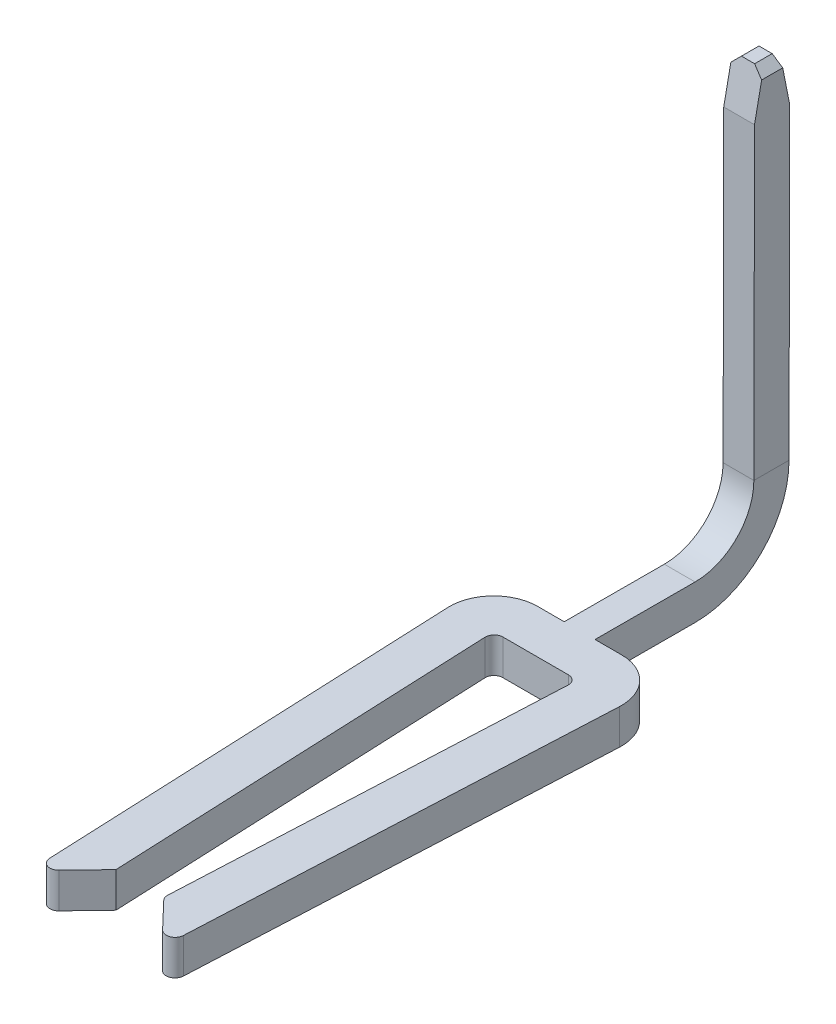
ISO-10303-21;
HEADER;
FILE_DESCRIPTION(('STEP AP214'),'2;1');
FILE_NAME('part.step','',(''),(''),'','','');
FILE_SCHEMA(('AUTOMOTIVE_DESIGN { 1 0 10303 214 1 1 1 1 }'));
ENDSEC;
DATA;
#1=APPLICATION_CONTEXT('core data for automotive mechanical design processes');
#2=APPLICATION_PROTOCOL_DEFINITION('international standard','automotive_design',2000,#1);
#3=PRODUCT_CONTEXT('',#1,'mechanical');
#4=PRODUCT('Part','Part','',(#3));
#5=PRODUCT_RELATED_PRODUCT_CATEGORY('part','',(#4));
#6=PRODUCT_DEFINITION_FORMATION('','',#4);
#7=PRODUCT_DEFINITION_CONTEXT('part definition',#1,'design');
#8=PRODUCT_DEFINITION('design','',#6,#7);
#9=PRODUCT_DEFINITION_SHAPE('','',#8);
#10=(LENGTH_UNIT() NAMED_UNIT(*) SI_UNIT(.MILLI.,.METRE.));
#11=(NAMED_UNIT(*) PLANE_ANGLE_UNIT() SI_UNIT($,.RADIAN.));
#12=(NAMED_UNIT(*) SI_UNIT($,.STERADIAN.) SOLID_ANGLE_UNIT());
#13=UNCERTAINTY_MEASURE_WITH_UNIT(LENGTH_MEASURE(1.E-05),#10,'distance_accuracy_value','');
#14=(GEOMETRIC_REPRESENTATION_CONTEXT(3) GLOBAL_UNCERTAINTY_ASSIGNED_CONTEXT((#13)) GLOBAL_UNIT_ASSIGNED_CONTEXT((#10,
#11,#12)) REPRESENTATION_CONTEXT('',''));
#15=CARTESIAN_POINT('',(0.,0.,0.));
#16=DIRECTION('',(0.,0.,1.));
#17=DIRECTION('',(1.,0.,0.));
#18=AXIS2_PLACEMENT_3D('',#15,#16,#17);
#19=CARTESIAN_POINT('',(0.175007184791,-1.635275026444,-1.901700244763));
#20=DIRECTION('',(0.999999999989373,3.26328490643722E-06,3.25642428496722E-06));
#21=DIRECTION('',(-3.26328490645452E-06,0.999999999994676,0.));
#22=AXIS2_PLACEMENT_3D('',#19,#20,#21);
#23=PLANE('',#22);
#24=DIRECTION('',(-4.07195006625834E-06,0.999997785368175,-0.00210457648106398));
#25=VECTOR('',#24,1.);
#26=CARTESIAN_POINT('',(0.175001265748,0.864719102488,-1.90696168524801));
#27=LINE('',#26,#25);
#28=CARTESIAN_POINT('',(0.175001265748064,0.864719057054746,-1.90696168515226));
#29=VERTEX_POINT('',#28);
#30=CARTESIAN_POINT('',(0.174986703487548,4.3647108574861,-1.91432775567154));
#31=VERTEX_POINT('',#30);
#32=EDGE_CURVE('E227',#29,#31,#27,.T.);
#33=ORIENTED_EDGE('',*,*,#32,.T.);
#34=DIRECTION('',(0.,0.980991245476944,0.194051993799582));
#35=VECTOR('',#34,1.);
#36=CARTESIAN_POINT('',(0.174986082613,4.86492037806116,-1.81538034350575));
#37=LINE('',#36,#35);
#38=CARTESIAN_POINT('',(0.174986082613017,4.76487916604904,-1.83516971139514));
#39=VERTEX_POINT('',#38);
#40=EDGE_CURVE('E203',#39,#31,#37,.F.);
#41=ORIENTED_EDGE('',*,*,#40,.F.);
#42=DIRECTION('',(-3.30868077392644E-06,0.00210462186325552,0.99999778527548));
#43=VECTOR('',#42,1.);
#44=CARTESIAN_POINT('',(0.17498608261305,4.76487916604905,-1.835169711395));
#45=LINE('',#44,#43);
#46=CARTESIAN_POINT('',(0.17498529579303,4.76538428612037,-1.59517027672773));
#47=VERTEX_POINT('',#46);
#48=EDGE_CURVE('E201',#39,#47,#45,.T.);
#49=ORIENTED_EDGE('',*,*,#48,.T.);
#50=DIRECTION('',(2.55320347847857E-06,-0.980165740764821,0.198179516157528));
#51=VECTOR('',#50,1.);
#52=CARTESIAN_POINT('',(0.174985299424531,4.765384286063,-1.595170303966));
#53=LINE('',#52,#51);
#54=CARTESIAN_POINT('',(0.174985762316875,4.36555335752195,-1.51432857148358));
#55=VERTEX_POINT('',#54);
#56=EDGE_CURVE('E186',#47,#55,#53,.T.);
#57=ORIENTED_EDGE('',*,*,#56,.T.);
#58=DIRECTION('',(-4.08966885710381E-06,0.999997785368103,-0.00210457648112173));
#59=VECTOR('',#58,1.);
#60=CARTESIAN_POINT('',(0.174999960434,0.865561368804003,-1.50696257201604));
#61=LINE('',#60,#59);
#62=CARTESIAN_POINT('',(0.174999960433802,0.865561261852998,-1.50696257179114));
#63=VERTEX_POINT('',#62);
#64=EDGE_CURVE('E215',#63,#55,#61,.T.);
#65=ORIENTED_EDGE('',*,*,#64,.F.);
#66=DIRECTION('',(3.26328845320044E-06,-0.00210566578999659,-0.999997783078009));
#67=VECTOR('',#66,1.);
#68=CARTESIAN_POINT('',(0.174997738415994,0.86556136879675,-1.50696257202324));
#69=LINE('',#68,#67);
#70=EDGE_CURVE('E198',#63,#29,#69,.T.);
#71=ORIENTED_EDGE('',*,*,#70,.T.);
#72=EDGE_LOOP('',(#33,#41,#49,#57,#65,#71));
#73=FACE_BOUND('',#72,.T.);
#74=ADVANCED_FACE('F17',(#73),#23,.T.);
#75=CARTESIAN_POINT('',(0.07498536537731,4.865131167434,-1.715380760441));
#76=DIRECTION('',(-0.707104478539354,-0.707107522698354,0.00148585765971574));
#77=DIRECTION('',(0.70710830326609,-0.707105259103729,0.));
#78=AXIS2_PLACEMENT_3D('',#75,#76,#77);
#79=PLANE('',#78);
#80=ORIENTED_EDGE('',*,*,#48,.F.);
#81=DIRECTION('',(0.700142727687881,-0.700430955632422,-0.13855192982281));
#82=VECTOR('',#81,1.);
#83=CARTESIAN_POINT('',(0.0749860891614756,4.8649203265247,-1.81538061479096));
#84=LINE('',#83,#82);
#85=CARTESIAN_POINT('',(0.0749858234301481,4.86492035862576,-1.81538064601225));
#86=VERTEX_POINT('',#85);
#87=EDGE_CURVE('E234',#86,#39,#84,.T.);
#88=ORIENTED_EDGE('',*,*,#87,.F.);
#89=DIRECTION('',(0.,0.00210457647842051,0.999997785376471));
#90=VECTOR('',#89,1.);
#91=CARTESIAN_POINT('',(0.0749850053663229,4.86513116691711,-1.715381005187));
#92=LINE('',#91,#90);
#93=CARTESIAN_POINT('',(0.0749851518626242,4.86534139644322,-1.61538091278752));
#94=VERTEX_POINT('',#93);
#95=EDGE_CURVE('E207',#94,#86,#92,.F.);
#96=ORIENTED_EDGE('',*,*,#95,.F.);
#97=DIRECTION('',(0.700142542464223,-0.699840855927141,0.141503344861177));
#98=VECTOR('',#97,1.);
#99=CARTESIAN_POINT('',(0.0749850053667493,4.86534150170193,-1.61538095695846));
#100=LINE('',#99,#98);
#101=EDGE_CURVE('E192',#94,#47,#100,.T.);
#102=ORIENTED_EDGE('',*,*,#101,.T.);
#103=EDGE_LOOP('',(#80,#88,#96,#102));
#104=FACE_BOUND('',#103,.T.);
#105=ADVANCED_FACE('F209',(#104),#79,.F.);
#106=CARTESIAN_POINT('',(-1.463462188596E-05,4.865130922687,-1.715381004673));
#107=DIRECTION('',(-3.25642428491755E-06,0.999997785371169,-0.00210457647840935));
#108=DIRECTION('',(0.,0.00210457647842051,0.999997785376471));
#109=AXIS2_PLACEMENT_3D('',#106,#107,#108);
#110=PLANE('',#109);
#111=DIRECTION('',(0.999999999992633,7.60721855878472E-07,3.76241672235528E-06));
#112=VECTOR('',#111,1.);
#113=CARTESIAN_POINT('',(-1.496095037655E-05,4.86534122499831,-1.61538119472873));
#114=LINE('',#113,#112);
#115=CARTESIAN_POINT('',(-0.0750149555543873,4.86534114980943,-1.61538154880574));
#116=VERTEX_POINT('',#115);
#117=EDGE_CURVE('E211',#116,#94,#114,.T.);
#118=ORIENTED_EDGE('',*,*,#117,.T.);
#119=ORIENTED_EDGE('',*,*,#95,.T.);
#120=DIRECTION('',(0.99999999999672,-4.97020864438531E-07,2.51259009138112E-06));
#121=VECTOR('',#120,1.);
#122=CARTESIAN_POINT('',(-1.430829339538E-05,4.86492022044195,-1.81538083159447));
#123=LINE('',#122,#121);
#124=CARTESIAN_POINT('',(-0.0750141915805117,4.86492031057738,-1.81538102513748));
#125=VERTEX_POINT('',#124);
#126=EDGE_CURVE('E238',#125,#86,#123,.T.);
#127=ORIENTED_EDGE('',*,*,#126,.F.);
#128=DIRECTION('',(-3.81987094945477E-06,0.00210401987934018,0.999997786540428));
#129=VECTOR('',#128,1.);
#130=CARTESIAN_POINT('',(-0.0750141915804922,4.86492033700683,-1.81538102768701));
#131=LINE('',#130,#129);
#132=EDGE_CURVE('E213',#125,#116,#131,.T.);
#133=ORIENTED_EDGE('',*,*,#132,.T.);
#134=EDGE_LOOP('',(#118,#119,#127,#133));
#135=FACE_BOUND('',#134,.T.);
#136=ADVANCED_FACE('F347',(#135),#110,.T.);
#137=CARTESIAN_POINT('',(-1.430829339538E-05,4.86492046504,-1.81538078321));
#138=DIRECTION('',(2.56127677282129E-06,0.194051993798946,-0.980991245473727));
#139=DIRECTION('',(0.,0.980991245476944,0.194051993799582));
#140=AXIS2_PLACEMENT_3D('',#137,#138,#139);
#141=PLANE('',#140);
#142=ORIENTED_EDGE('',*,*,#40,.T.);
#143=DIRECTION('',(0.999999999994675,6.8678326205611E-09,3.26327767890409E-06));
#144=VECTOR('',#143,1.);
#145=CARTESIAN_POINT('',(-0.660698484761,4.3647108411043,-1.91433042894395));
#146=LINE('',#145,#144);
#147=CARTESIAN_POINT('',(-0.175015510132432,4.36471074053463,-1.91432884380651));
#148=VERTEX_POINT('',#147);
#149=EDGE_CURVE('E160',#31,#148,#146,.F.);
#150=ORIENTED_EDGE('',*,*,#149,.T.);
#151=DIRECTION('',(4.7174800590008E-06,-0.980991172480558,-0.194052362760582));
#152=VECTOR('',#151,1.);
#153=CARTESIAN_POINT('',(-0.175017434485288,4.764876273044,-1.835171070071));
#154=LINE('',#153,#152);
#155=CARTESIAN_POINT('',(-0.175017212198714,4.7648757647061,-1.8351711400612));
#156=VERTEX_POINT('',#155);
#157=EDGE_CURVE('E352',#156,#148,#154,.T.);
#158=ORIENTED_EDGE('',*,*,#157,.F.);
#159=DIRECTION('',(0.70013752989478,0.700435695926638,0.138554231637299));
#160=VECTOR('',#159,1.);
#161=CARTESIAN_POINT('',(-0.175016551117714,4.76487538968443,-1.83517106820902));
#162=LINE('',#161,#160);
#163=EDGE_CURVE('E341',#156,#125,#162,.T.);
#164=ORIENTED_EDGE('',*,*,#163,.T.);
#165=ORIENTED_EDGE('',*,*,#126,.T.);
#166=ORIENTED_EDGE('',*,*,#87,.T.);
#167=EDGE_LOOP('',(#142,#150,#158,#164,#165,#166));
#168=FACE_BOUND('',#167,.T.);
#169=ADVANCED_FACE('F349',(#168),#141,.T.);
#170=CARTESIAN_POINT('',(-0.660698484761,-6.897092851477,-1.890629049418));
#171=DIRECTION('',(-3.26328490585155E-06,0.00210457646778235,0.999997785371169));
#172=DIRECTION('',(0.,-0.999997785376493,0.00210457646779356));
#173=AXIS2_PLACEMENT_3D('',#170,#171,#172);
#174=PLANE('',#173);
#175=DIRECTION('',(0.999999999994675,6.8678326205611E-09,3.26327767890409E-06));
#176=VECTOR('',#175,1.);
#177=CARTESIAN_POINT('',(-0.660698484761,0.864719005889311,-1.90696441217713));
#178=LINE('',#177,#176);
#179=CARTESIAN_POINT('',(-0.175000956269712,0.864719059929716,-1.90696282731777));
#180=VERTEX_POINT('',#179);
#181=EDGE_CURVE('E230',#180,#29,#178,.T.);
#182=ORIENTED_EDGE('',*,*,#181,.F.);
#183=DIRECTION('',(4.15824722816176E-06,-0.999997785367819,0.0021045764812607));
#184=VECTOR('',#183,1.);
#185=CARTESIAN_POINT('',(-0.175015510132432,4.364710688582,-1.914328843697));
#186=LINE('',#185,#184);
#187=EDGE_CURVE('E372',#148,#180,#186,.T.);
#188=ORIENTED_EDGE('',*,*,#187,.F.);
#189=ORIENTED_EDGE('',*,*,#149,.F.);
#190=ORIENTED_EDGE('',*,*,#32,.F.);
#191=EDGE_LOOP('',(#182,#188,#189,#190));
#192=FACE_BOUND('',#191,.T.);
#193=ADVANCED_FACE('F389',(#192),#174,.F.);
#194=CARTESIAN_POINT('',(-0.660699790075,-6.89625102089,-1.490629935269));
#195=DIRECTION('',(-3.26328490585155E-06,0.00210457646778235,0.999997785371169));
#196=DIRECTION('',(0.,-0.999997785376493,0.00210457646779356));
#197=AXIS2_PLACEMENT_3D('',#194,#195,#196);
#198=PLANE('',#197);
#199=DIRECTION('',(0.999999999992633,7.60721855878472E-07,3.76241672235528E-06));
#200=VECTOR('',#199,1.);
#201=CARTESIAN_POINT('',(-1.496095037655E-05,4.36555322510836,-1.51432921593992));
#202=LINE('',#201,#200);
#203=CARTESIAN_POINT('',(-0.17501681544553,4.36555277251354,-1.51432980977728));
#204=VERTEX_POINT('',#203);
#205=EDGE_CURVE('E194',#55,#204,#202,.F.);
#206=ORIENTED_EDGE('',*,*,#205,.T.);
#207=DIRECTION('',(-4.15824718365189E-06,0.999997785339116,-0.00210459011975487));
#208=VECTOR('',#207,1.);
#209=CARTESIAN_POINT('',(-0.175002261582777,0.865560938618,-1.506963713271));
#210=LINE('',#209,#208);
#211=CARTESIAN_POINT('',(-0.175002261582763,0.865560935371559,-1.50696371326376));
#212=VERTEX_POINT('',#211);
#213=EDGE_CURVE('E320',#212,#204,#210,.T.);
#214=ORIENTED_EDGE('',*,*,#213,.F.);
#215=DIRECTION('',(0.999999999994675,6.8678326205611E-09,3.26327767890409E-06));
#216=VECTOR('',#215,1.);
#217=CARTESIAN_POINT('',(-0.660699790075,0.865560935282314,-1.50696529823608));
#218=LINE('',#217,#216);
#219=EDGE_CURVE('E229',#212,#63,#218,.T.);
#220=ORIENTED_EDGE('',*,*,#219,.T.);
#221=ORIENTED_EDGE('',*,*,#64,.T.);
#222=EDGE_LOOP('',(#206,#214,#220,#221));
#223=FACE_BOUND('',#222,.T.);
#224=ADVANCED_FACE('F399',(#223),#198,.T.);
#225=CARTESIAN_POINT('',(-1.496095037655E-05,4.865341380334,-1.615381226136));
#226=DIRECTION('',(3.8385514630743E-06,-0.198179407828912,-0.980165762663565));
#227=DIRECTION('',(0.,0.980165762670786,-0.198179407830372));
#228=AXIS2_PLACEMENT_3D('',#225,#226,#227);
#229=PLANE('',#228);
#230=DIRECTION('',(-3.43751459113788E-06,0.980165762662906,-0.198179407839529));
#231=VECTOR('',#230,1.);
#232=CARTESIAN_POINT('',(-0.17501681544553,4.36555261278,-1.514329777481));
#233=LINE('',#232,#231);
#234=CARTESIAN_POINT('',(-0.175017074048855,4.76538265680208,-1.59517134719816));
#235=VERTEX_POINT('',#234);
#236=EDGE_CURVE('E314',#204,#235,#233,.T.);
#237=ORIENTED_EDGE('',*,*,#236,.F.);
#238=ORIENTED_EDGE('',*,*,#205,.F.);
#239=ORIENTED_EDGE('',*,*,#56,.F.);
#240=ORIENTED_EDGE('',*,*,#101,.F.);
#241=ORIENTED_EDGE('',*,*,#117,.F.);
#242=DIRECTION('',(-0.700138302177797,-0.69984616149523,0.141498085018792));
#243=VECTOR('',#242,1.);
#244=CARTESIAN_POINT('',(-0.0750149555542452,4.86534114074205,-1.61538158475363));
#245=LINE('',#244,#243);
#246=EDGE_CURVE('E334',#116,#235,#245,.T.);
#247=ORIENTED_EDGE('',*,*,#246,.T.);
#248=EDGE_LOOP('',(#237,#238,#239,#240,#241,#247));
#249=FACE_BOUND('',#248,.T.);
#250=ADVANCED_FACE('F189',(#249),#229,.F.);
#251=CARTESIAN_POINT('',(-0.07501463462109,4.865130677941,-1.715381248905));
#252=DIRECTION('',(0.707109083818662,-0.707102907716663,0.00149046293910129));
#253=DIRECTION('',(0.707103693125375,0.707109869234234,0.));
#254=AXIS2_PLACEMENT_3D('',#251,#252,#253);
#255=PLANE('',#254);
#256=DIRECTION('',(3.26330253224649E-06,-0.00210947513947798,-0.999997775049518));
#257=VECTOR('',#256,1.);
#258=CARTESIAN_POINT('',(-0.175018217678997,4.76538254778951,-1.59517126651795));
#259=LINE('',#258,#257);
#260=EDGE_CURVE('E308',#235,#156,#259,.T.);
#261=ORIENTED_EDGE('',*,*,#260,.F.);
#262=ORIENTED_EDGE('',*,*,#246,.F.);
#263=ORIENTED_EDGE('',*,*,#132,.F.);
#264=ORIENTED_EDGE('',*,*,#163,.F.);
#265=EDGE_LOOP('',(#261,#262,#263,#264));
#266=FACE_BOUND('',#265,.T.);
#267=ADVANCED_FACE('F355',(#266),#255,.F.);
#268=CARTESIAN_POINT('',(-0.175000956267,0.864718407818,-1.906962825945));
#269=DIRECTION('',(-0.99999999998603,-4.16510584607213E-06,-3.2545235860591E-06));
#270=DIRECTION('',(4.16510584609418E-06,-0.999999999991326,0.));
#271=AXIS2_PLACEMENT_3D('',#268,#269,#270);
#272=PLANE('',#271);
#273=ORIENTED_EDGE('',*,*,#236,.T.);
#274=ORIENTED_EDGE('',*,*,#260,.T.);
#275=ORIENTED_EDGE('',*,*,#157,.T.);
#276=ORIENTED_EDGE('',*,*,#187,.T.);
#277=CARTESIAN_POINT('',(-0.175004438076532,0.866964619264,-0.840000571091002));
#278=DIRECTION('',(-0.99999999998603,-4.16510584607213E-06,-3.2545235860591E-06));
#279=DIRECTION('',(4.16510584609418E-06,-0.999999999991326,0.));
#280=AXIS2_PLACEMENT_3D('',#277,#278,#279);
#281=CIRCLE('',#280,1.066964619264);
#282=CARTESIAN_POINT('',(-0.175000001373896,-0.199997635597067,-0.837754366385486));
#283=VERTEX_POINT('',#282);
#284=EDGE_CURVE('E306',#283,#180,#281,.F.);
#285=ORIENTED_EDGE('',*,*,#284,.F.);
#286=DIRECTION('',(-4.15825071394713E-06,0.999997787615261,-0.00210350832939722));
#287=VECTOR('',#286,1.);
#288=CARTESIAN_POINT('',(-0.175000001374678,-0.199997636534373,-0.837754812455384));
#289=LINE('',#288,#287);
#290=CARTESIAN_POINT('',(-0.175001248160876,0.200001478314055,-0.838596305500264));
#291=VERTEX_POINT('',#290);
#292=EDGE_CURVE('E364',#283,#291,#289,.T.);
#293=ORIENTED_EDGE('',*,*,#292,.T.);
#294=CARTESIAN_POINT('',(-0.175004438076532,0.866964619264,-0.840000571091002));
#295=DIRECTION('',(-0.99999999998603,-4.16510584607213E-06,-3.2545235860591E-06));
#296=DIRECTION('',(4.16510584609418E-06,-0.999999999991326,0.));
#297=AXIS2_PLACEMENT_3D('',#294,#295,#296);
#298=CIRCLE('',#297,0.666964619264);
#299=EDGE_CURVE('E20',#291,#212,#298,.F.);
#300=ORIENTED_EDGE('',*,*,#299,.T.);
#301=ORIENTED_EDGE('',*,*,#213,.T.);
#302=EDGE_LOOP('',(#273,#274,#275,#276,#285,#293,#300,#301));
#303=FACE_BOUND('',#302,.T.);
#304=ADVANCED_FACE('F358',(#303),#272,.T.);
#305=CARTESIAN_POINT('',(-0.175004437551,0.866964619264,-0.840000571091));
#306=DIRECTION('',(0.999999999994676,0.,3.26329213278694E-06));
#307=DIRECTION('',(3.26329213278694E-06,0.,-0.999999999994676));
#308=AXIS2_PLACEMENT_3D('',#305,#306,#307);
#309=CYLINDRICAL_SURFACE('',#308,1.066964619264);
#310=ORIENTED_EDGE('',*,*,#284,.T.);
#311=ORIENTED_EDGE('',*,*,#181,.T.);
#312=CARTESIAN_POINT('',(0.175000005953661,0.866964619264,-0.839999428924253));
#313=DIRECTION('',(0.999999999999593,-8.76572615124444E-09,-9.01817128790433E-07));
#314=DIRECTION('',(-9.01817128790433E-07,0.,-0.999999999999593));
#315=AXIS2_PLACEMENT_3D('',#312,#313,#314);
#316=CIRCLE('',#315,1.066964619264);
#317=CARTESIAN_POINT('',(0.174999998626113,-0.199997636811358,-0.837753795295367));
#318=VERTEX_POINT('',#317);
#319=EDGE_CURVE('E275',#318,#29,#316,.T.);
#320=ORIENTED_EDGE('',*,*,#319,.F.);
#321=DIRECTION('',(1.,-6.86783262048714E-09,1.44539109276797E-11));
#322=VECTOR('',#321,1.);
#323=CARTESIAN_POINT('',(-0.660722805629,-0.199997630809533,-0.837753670307077));
#324=LINE('',#323,#322);
#325=EDGE_CURVE('E305',#318,#283,#324,.F.);
#326=ORIENTED_EDGE('',*,*,#325,.T.);
#327=EDGE_LOOP('',(#310,#311,#320,#326));
#328=FACE_BOUND('',#327,.T.);
#329=ADVANCED_FACE('F392',(#328),#309,.T.);
#330=CARTESIAN_POINT('',(-0.660722805629,-0.186528338606,5.562233491171));
#331=DIRECTION('',(6.86784783018439E-09,0.999997785376493,-0.00210457646777704));
#332=DIRECTION('',(0.,0.00210457646777704,0.999997785376493));
#333=AXIS2_PLACEMENT_3D('',#330,#331,#332);
#334=PLANE('',#333);
#335=DIRECTION('',(0.690866245713118,-0.0015215768985155,-0.722980992376704));
#336=VECTOR('',#335,1.);
#337=CARTESIAN_POINT('',(-0.588424546285314,-0.186382941018001,5.6313199627507));
#338=LINE('',#337,#336);
#339=CARTESIAN_POINT('',(-0.588424546281254,-0.186382941017999,5.63131996274646));
#340=VERTEX_POINT('',#339);
#341=CARTESIAN_POINT('',(-0.272211011649011,-0.187079375693,5.30040732011809));
#342=VERTEX_POINT('',#341);
#343=EDGE_CURVE('E304',#340,#342,#338,.T.);
#344=ORIENTED_EDGE('',*,*,#343,.F.);
#345=CARTESIAN_POINT('',(-0.660722805629,-0.186528338605776,5.562233491171));
#346=DIRECTION('',(6.86784783018439E-09,0.999997785376493,-0.00210457646777704));
#347=DIRECTION('',(0.,0.00210457646777704,0.999997785376493));
#348=AXIS2_PLACEMENT_3D('',#345,#346,#347);
#349=CIRCLE('',#348,0.09999999999961);
#350=CARTESIAN_POINT('',(-0.760619662735631,-0.186518781673089,5.56677417930156));
#351=VERTEX_POINT('',#350);
#352=EDGE_CURVE('E303',#351,#340,#349,.T.);
#353=ORIENTED_EDGE('',*,*,#352,.F.);
#354=DIRECTION('',(0.0454076609258709,0.00210240536994618,0.998966327871416));
#355=VECTOR('',#354,1.);
#356=CARTESIAN_POINT('',(-0.976240736340313,-0.196502183015,0.823121066176969));
#357=LINE('',#356,#355);
#358=CARTESIAN_POINT('',(-0.976240736340649,-0.196502183015032,0.823121066176624));
#359=VERTEX_POINT('',#358);
#360=EDGE_CURVE('E270',#359,#351,#357,.T.);
#361=ORIENTED_EDGE('',*,*,#360,.F.);
#362=CARTESIAN_POINT('',(-0.476756466236,-0.196549968392728,0.800417286001));
#363=DIRECTION('',(6.86784783018439E-09,0.999997785376493,-0.00210457646777704));
#364=DIRECTION('',(0.,0.00210457646777704,0.999997785376493));
#365=AXIS2_PLACEMENT_3D('',#362,#363,#364);
#366=CIRCLE('',#365,0.5);
#367=CARTESIAN_POINT('',(-0.47675623153057,-0.197602257662886,0.300418393315011));
#368=VERTEX_POINT('',#367);
#369=EDGE_CURVE('E267',#368,#359,#366,.T.);
#370=ORIENTED_EDGE('',*,*,#369,.F.);
#371=DIRECTION('',(1.,0.,-7.22694751364728E-12));
#372=VECTOR('',#371,1.);
#373=CARTESIAN_POINT('',(-0.175000001365,-0.197602258699158,0.300418393315));
#374=LINE('',#373,#372);
#375=CARTESIAN_POINT('',(-0.174999999533902,-0.197602258699161,0.300418393315));
#376=VERTEX_POINT('',#375);
#377=EDGE_CURVE('E452',#376,#368,#374,.F.);
#378=ORIENTED_EDGE('',*,*,#377,.F.);
#379=DIRECTION('',(7.22712150207986E-12,0.00210457645886207,0.999997785376512));
#380=VECTOR('',#379,1.);
#381=CARTESIAN_POINT('',(-0.175000001373931,-0.199997636539008,-0.837754812459));
#382=LINE('',#381,#380);
#383=EDGE_CURVE('E274',#283,#376,#382,.T.);
#384=ORIENTED_EDGE('',*,*,#383,.F.);
#385=ORIENTED_EDGE('',*,*,#325,.F.);
#386=DIRECTION('',(-9.01833579726922E-07,-0.00210457646670764,-0.999997785376089));
#387=VECTOR('',#386,1.);
#388=CARTESIAN_POINT('',(0.175001025070285,-0.197602261103005,0.300418393315483));
#389=LINE('',#388,#387);
#390=CARTESIAN_POINT('',(0.175000834010523,-0.197602261793668,0.300418393317789));
#391=VERTEX_POINT('',#390);
#392=EDGE_CURVE('E278',#391,#318,#389,.T.);
#393=ORIENTED_EDGE('',*,*,#392,.F.);
#394=DIRECTION('',(1.,0.,-7.22806456795742E-12));
#395=VECTOR('',#394,1.);
#396=CARTESIAN_POINT('',(0.999999998635,-0.197602263175008,0.300418393316436));
#397=LINE('',#396,#395);
#398=CARTESIAN_POINT('',(0.476756466381,-0.197602263175158,0.300418393319986));
#399=VERTEX_POINT('',#398);
#400=EDGE_CURVE('E471',#399,#391,#397,.F.);
#401=ORIENTED_EDGE('',*,*,#400,.F.);
#402=CARTESIAN_POINT('',(0.476756463512,-0.196549974941427,0.800417286008001));
#403=DIRECTION('',(6.86784783018439E-09,0.999997785376493,-0.00210457646777704));
#404=DIRECTION('',(0.,0.00210457646777704,0.999997785376493));
#405=AXIS2_PLACEMENT_3D('',#402,#403,#404);
#406=CIRCLE('',#405,0.5);
#407=CARTESIAN_POINT('',(0.976240729692029,-0.196502196242748,0.82312115254883));
#408=VERTEX_POINT('',#407);
#409=EDGE_CURVE('E279',#408,#399,#406,.T.);
#410=ORIENTED_EDGE('',*,*,#409,.F.);
#411=DIRECTION('',(0.0454076609115371,-0.00210240599362932,-0.998966327870755));
#412=VECTOR('',#411,1.);
#413=CARTESIAN_POINT('',(0.760619656992454,-0.186518791978,5.56677424725302));
#414=LINE('',#413,#412);
#415=CARTESIAN_POINT('',(0.760619656992738,-0.186518791977696,5.56677424724676));
#416=VERTEX_POINT('',#415);
#417=EDGE_CURVE('E287',#416,#408,#414,.T.);
#418=ORIENTED_EDGE('',*,*,#417,.F.);
#419=CARTESIAN_POINT('',(0.660722802972,-0.186528347680778,5.562233491204));
#420=DIRECTION('',(6.86784783018439E-09,0.999997785376493,-0.00210457646777704));
#421=DIRECTION('',(0.,0.00210457646777704,0.999997785376493));
#422=AXIS2_PLACEMENT_3D('',#419,#420,#421);
#423=CIRCLE('',#422,0.09999999999964);
#424=CARTESIAN_POINT('',(0.588424496664853,-0.186382949203572,5.63131991363533));
#425=VERTEX_POINT('',#424);
#426=EDGE_CURVE('E284',#425,#416,#423,.T.);
#427=ORIENTED_EDGE('',*,*,#426,.F.);
#428=DIRECTION('',(0.690866245774942,0.00152156740886793,0.722980992337598));
#429=VECTOR('',#428,1.);
#430=CARTESIAN_POINT('',(0.301751149811922,-0.187014320072,5.33132062715707));
#431=LINE('',#430,#429);
#432=CARTESIAN_POINT('',(0.301751149811786,-0.187014320072156,5.33132062715693));
#433=VERTEX_POINT('',#432);
#434=EDGE_CURVE('E481',#433,#425,#431,.T.);
#435=ORIENTED_EDGE('',*,*,#434,.F.);
#436=CARTESIAN_POINT('',(0.374049409157,-0.187159718653166,5.262234155582));
#437=DIRECTION('',(6.86784783018439E-09,0.999997785376493,-0.00210457646777704));
#438=DIRECTION('',(0.,0.00210457646777704,0.999997785376493));
#439=AXIS2_PLACEMENT_3D('',#436,#437,#438);
#440=CIRCLE('',#439,0.09999999999845);
#441=CARTESIAN_POINT('',(0.274152562356266,-0.187169274690775,5.25769324073826));
#442=VERTEX_POINT('',#441);
#443=EDGE_CURVE('E289',#442,#433,#440,.T.);
#444=ORIENTED_EDGE('',*,*,#443,.F.);
#445=DIRECTION('',(0.0454076609032242,-0.00210240599345277,-0.998966327871133));
#446=VECTOR('',#445,1.);
#447=CARTESIAN_POINT('',(0.274152569574585,-0.187169275025,5.25769308192998));
#448=LINE('',#447,#446);
#449=CARTESIAN_POINT('',(0.472004610463421,-0.196329960872,0.90495782058787));
#450=VERTEX_POINT('',#449);
#451=EDGE_CURVE('E297',#442,#450,#448,.T.);
#452=ORIENTED_EDGE('',*,*,#451,.T.);
#453=CARTESIAN_POINT('',(0.372107756443861,-0.196339516575385,0.90041706455211));
#454=DIRECTION('',(6.86784783018439E-09,0.999997785376493,-0.00210457646777704));
#455=DIRECTION('',(0.,0.00210457646777704,0.999997785376493));
#456=AXIS2_PLACEMENT_3D('',#453,#454,#455);
#457=CIRCLE('',#456,0.09999999999845);
#458=CARTESIAN_POINT('',(0.372107632816,-0.196549974222582,0.800417286016168));
#459=VERTEX_POINT('',#458);
#460=EDGE_CURVE('E294',#450,#459,#457,.T.);
#461=ORIENTED_EDGE('',*,*,#460,.T.);
#462=DIRECTION('',(1.,0.,-7.22694751364728E-12));
#463=VECTOR('',#462,1.);
#464=CARTESIAN_POINT('',(-0.476756463515,-0.196549974222993,0.800417286022381));
#465=LINE('',#464,#463);
#466=CARTESIAN_POINT('',(-0.372107759237,-0.196549971666997,0.800417286016318));
#467=VERTEX_POINT('',#466);
#468=EDGE_CURVE('E488',#459,#467,#465,.F.);
#469=ORIENTED_EDGE('',*,*,#468,.T.);
#470=CARTESIAN_POINT('',(-0.372107759236139,-0.196339511464226,0.90041706454711));
#471=DIRECTION('',(6.86784783018439E-09,0.999997785376493,-0.00210457646777704));
#472=DIRECTION('',(0.,0.00210457646777704,0.999997785376493));
#473=AXIS2_PLACEMENT_3D('',#470,#471,#472);
#474=CIRCLE('',#473,0.09999999999845);
#475=CARTESIAN_POINT('',(-0.472004610417831,-0.196329954257284,0.90495788301848));
#476=VERTEX_POINT('',#475);
#477=EDGE_CURVE('E299',#467,#476,#474,.T.);
#478=ORIENTED_EDGE('',*,*,#477,.T.);
#479=DIRECTION('',(0.0454076609344732,0.00210240536978161,0.998966327871025));
#480=VECTOR('',#479,1.);
#481=CARTESIAN_POINT('',(-0.472004607580191,-0.196329954126,0.904957945454008));
#482=LINE('',#481,#480);
#483=EDGE_CURVE('E492',#476,#342,#482,.T.);
#484=ORIENTED_EDGE('',*,*,#483,.T.);
#485=EDGE_LOOP('',(#344,#353,#361,#370,#378,#384,#385,#393,#401,#410,#418,#427,#435,#444,#452,
#461,#469,#478,#484));
#486=FACE_BOUND('',#485,.T.);
#487=ADVANCED_FACE('F520',(#486),#334,.F.);
#488=CARTESIAN_POINT('',(-0.588424546277,-0.186382941018,5.631319962742));
#489=DIRECTION('',(0.722982593520938,0.00145397587778387,0.69086471571494));
#490=DIRECTION('',(0.690865445975942,0.,-0.722983357731326));
#491=AXIS2_PLACEMENT_3D('',#488,#489,#490);
#492=PLANE('',#491);
#493=DIRECTION('',(6.86785955253923E-09,0.999997785376494,-0.00210457646751717));
#494=VECTOR('',#493,1.);
#495=CARTESIAN_POINT('',(-0.272211011649144,-0.187079375693,5.30040732011801));
#496=LINE('',#495,#494);
#497=CARTESIAN_POINT('',(-0.272211008902,0.212919738458174,5.299565489531));
#498=VERTEX_POINT('',#497);
#499=EDGE_CURVE('E302',#342,#498,#496,.T.);
#500=ORIENTED_EDGE('',*,*,#499,.T.);
#501=DIRECTION('',(0.690866245711876,-0.00152157689769276,-0.722980992377892));
#502=VECTOR('',#501,1.);
#503=CARTESIAN_POINT('',(-0.588424543538,0.213616173132796,5.630478132164));
#504=LINE('',#503,#502);
#505=CARTESIAN_POINT('',(-0.588424543533904,0.213616173132991,5.63047813215943));
#506=VERTEX_POINT('',#505);
#507=EDGE_CURVE('E433',#506,#498,#504,.T.);
#508=ORIENTED_EDGE('',*,*,#507,.F.);
#509=DIRECTION('',(6.86784783018439E-09,0.999997785376493,-0.00210457646777704));
#510=VECTOR('',#509,1.);
#511=CARTESIAN_POINT('',(-0.5884245462853,-0.186382941018204,5.63131996275071));
#512=LINE('',#511,#510);
#513=EDGE_CURVE('E438',#340,#506,#512,.T.);
#514=ORIENTED_EDGE('',*,*,#513,.F.);
#515=ORIENTED_EDGE('',*,*,#343,.T.);
#516=EDGE_LOOP('',(#500,#508,#514,#515));
#517=FACE_BOUND('',#516,.T.);
#518=ADVANCED_FACE('F528',(#517),#492,.T.);
#519=CARTESIAN_POINT('',(-0.272211008902,0.212919738458,5.299565489531));
#520=DIRECTION('',(-0.99896854020958,9.55707554081198E-05,0.0454075603591609));
#521=DIRECTION('',(0.045407560566532,0.,0.998968544771754));
#522=AXIS2_PLACEMENT_3D('',#519,#520,#521);
#523=PLANE('',#522);
#524=DIRECTION('',(-0.0454076609344626,-0.00210240536992245,-0.998966327871026));
#525=VECTOR('',#524,1.);
#526=CARTESIAN_POINT('',(-0.272211008902,0.212919738458174,5.299565489531));
#527=LINE('',#526,#525);
#528=CARTESIAN_POINT('',(-0.472004607670829,0.203669159892876,0.904116052431376));
#529=VERTEX_POINT('',#528);
#530=EDGE_CURVE('E266',#498,#529,#527,.T.);
#531=ORIENTED_EDGE('',*,*,#530,.F.);
#532=ORIENTED_EDGE('',*,*,#499,.F.);
#533=ORIENTED_EDGE('',*,*,#483,.F.);
#534=DIRECTION('',(6.86784783018439E-09,0.999997785376493,-0.00210457646777704));
#535=VECTOR('',#534,1.);
#536=CARTESIAN_POINT('',(-0.472004604832363,0.203669160024342,0.904116114866867));
#537=LINE('',#536,#535);
#538=EDGE_CURVE('E301',#476,#529,#537,.T.);
#539=ORIENTED_EDGE('',*,*,#538,.T.);
#540=EDGE_LOOP('',(#531,#532,#533,#539));
#541=FACE_BOUND('',#540,.T.);
#542=ADVANCED_FACE('F531',(#541),#523,.F.);
#543=CARTESIAN_POINT('',(-0.372107756489,0.203659602686,0.89957523396));
#544=DIRECTION('',(6.86784783018439E-09,0.999997785376493,-0.00210457646777704));
#545=DIRECTION('',(0.,0.00210457646777704,0.999997785376493));
#546=AXIS2_PLACEMENT_3D('',#543,#544,#545);
#547=CYLINDRICAL_SURFACE('',#546,0.09999999999845);
#548=ORIENTED_EDGE('',*,*,#477,.F.);
#549=DIRECTION('',(0.,0.999997785376493,-0.00210457646777704));
#550=VECTOR('',#549,1.);
#551=CARTESIAN_POINT('',(-0.372107759237,0.203449145757998,0.799575455422244));
#552=LINE('',#551,#550);
#553=CARTESIAN_POINT('',(-0.372107757863,0.203449145039161,0.799575455423938));
#554=VERTEX_POINT('',#553);
#555=EDGE_CURVE('E486',#467,#554,#552,.T.);
#556=ORIENTED_EDGE('',*,*,#555,.T.);
#557=CARTESIAN_POINT('',(-0.372107756489,0.203659602685658,0.899575233960001));
#558=DIRECTION('',(6.86784783018439E-09,0.999997785376493,-0.00210457646777704));
#559=DIRECTION('',(0.,0.00210457646777704,0.999997785376493));
#560=AXIS2_PLACEMENT_3D('',#557,#558,#559);
#561=CIRCLE('',#560,0.09999999999845);
#562=EDGE_CURVE('E263',#529,#554,#561,.F.);
#563=ORIENTED_EDGE('',*,*,#562,.F.);
#564=ORIENTED_EDGE('',*,*,#538,.F.);
#565=EDGE_LOOP('',(#548,#556,#563,#564));
#566=FACE_BOUND('',#565,.T.);
#567=ADVANCED_FACE('F587',(#566),#547,.F.);
#568=CARTESIAN_POINT('',(-0.476756463515,0.203449145758,0.799575455423));
#569=DIRECTION('',(-7.22696351865057E-12,-0.00210457646777704,-0.999997785376493));
#570=DIRECTION('',(0.,0.999997785376493,-0.00210457646777704));
#571=AXIS2_PLACEMENT_3D('',#568,#569,#570);
#572=PLANE('',#571);
#573=DIRECTION('',(1.,-6.86783262048714E-09,1.44539109276797E-11));
#574=VECTOR('',#573,1.);
#575=CARTESIAN_POINT('',(-0.660722802882,0.203449147021598,0.799575455419826));
#576=LINE('',#575,#574);
#577=CARTESIAN_POINT('',(0.37210769669057,0.203449141206154,0.799575455430621));
#578=VERTEX_POINT('',#577);
#579=EDGE_CURVE('E262',#554,#578,#576,.T.);
#580=ORIENTED_EDGE('',*,*,#579,.F.);
#581=ORIENTED_EDGE('',*,*,#555,.F.);
#582=ORIENTED_EDGE('',*,*,#468,.F.);
#583=DIRECTION('',(6.86784783018439E-09,0.999997785376493,-0.00210457646777704));
#584=VECTOR('',#583,1.);
#585=CARTESIAN_POINT('',(0.372107634190139,0.203449139928227,0.799575455428979));
#586=LINE('',#585,#584);
#587=EDGE_CURVE('E298',#459,#578,#586,.T.);
#588=ORIENTED_EDGE('',*,*,#587,.T.);
#589=EDGE_LOOP('',(#580,#581,#582,#588));
#590=FACE_BOUND('',#589,.T.);
#591=ADVANCED_FACE('F584',(#590),#572,.F.);
#592=CARTESIAN_POINT('',(0.372107759191,0.203659597575,0.899575233965));
#593=DIRECTION('',(6.86784783018439E-09,0.999997785376493,-0.00210457646777704));
#594=DIRECTION('',(0.,0.00210457646777704,0.999997785376493));
#595=AXIS2_PLACEMENT_3D('',#592,#593,#594);
#596=CYLINDRICAL_SURFACE('',#595,0.09999999999845);
#597=DIRECTION('',(6.8678347514317E-09,0.999997785376494,-0.00210457646748855));
#598=VECTOR('',#597,1.);
#599=CARTESIAN_POINT('',(0.472004610463414,-0.196329960872,0.904957820588019));
#600=LINE('',#599,#598);
#601=CARTESIAN_POINT('',(0.472004613210411,0.203669154556304,0.904115989998328));
#602=VERTEX_POINT('',#601);
#603=EDGE_CURVE('E293',#450,#602,#600,.T.);
#604=ORIENTED_EDGE('',*,*,#603,.T.);
#605=CARTESIAN_POINT('',(0.372107759191,0.203659600130785,0.899575233959621));
#606=DIRECTION('',(6.86784783018439E-09,0.999997785376493,-0.00210457646777704));
#607=DIRECTION('',(0.,0.00210457646777704,0.999997785376493));
#608=AXIS2_PLACEMENT_3D('',#605,#606,#607);
#609=CIRCLE('',#608,0.09999999999845);
#610=EDGE_CURVE('E259',#578,#602,#609,.F.);
#611=ORIENTED_EDGE('',*,*,#610,.F.);
#612=ORIENTED_EDGE('',*,*,#587,.F.);
#613=ORIENTED_EDGE('',*,*,#460,.F.);
#614=EDGE_LOOP('',(#604,#611,#612,#613));
#615=FACE_BOUND('',#614,.T.);
#616=ADVANCED_FACE('F580',(#615),#596,.F.);
#617=CARTESIAN_POINT('',(0.476756466213,0.203449139209,0.79957545543));
#618=DIRECTION('',(0.998968540211001,9.55570338448901E-05,0.04540756035679));
#619=DIRECTION('',(0.0454075605641016,0.,-0.998968544771865));
#620=AXIS2_PLACEMENT_3D('',#617,#618,#619);
#621=PLANE('',#620);
#622=DIRECTION('',(-0.0454076609030339,0.00210240599362989,0.998966327871142));
#623=VECTOR('',#622,1.);
#624=CARTESIAN_POINT('',(0.47200461321,0.203669153278438,0.904115990000997));
#625=LINE('',#624,#623);
#626=CARTESIAN_POINT('',(0.274152565103546,0.212829839460536,5.25685141015116));
#627=VERTEX_POINT('',#626);
#628=EDGE_CURVE('E258',#602,#627,#625,.T.);
#629=ORIENTED_EDGE('',*,*,#628,.F.);
#630=ORIENTED_EDGE('',*,*,#603,.F.);
#631=ORIENTED_EDGE('',*,*,#451,.F.);
#632=DIRECTION('',(6.86784783018439E-09,0.999997785376493,-0.00210457646777704));
#633=VECTOR('',#632,1.);
#634=CARTESIAN_POINT('',(0.274152569575089,-0.187169275024834,5.25769308193012));
#635=LINE('',#634,#633);
#636=EDGE_CURVE('E292',#627,#442,#635,.F.);
#637=ORIENTED_EDGE('',*,*,#636,.F.);
#638=EDGE_LOOP('',(#629,#630,#631,#637));
#639=FACE_BOUND('',#638,.T.);
#640=ADVANCED_FACE('F575',(#639),#621,.F.);
#641=CARTESIAN_POINT('',(0.374049409157,-0.187159718653,5.262234155582));
#642=DIRECTION('',(6.86784783018439E-09,0.999997785376493,-0.00210457646777704));
#643=DIRECTION('',(0.,0.00210457646777704,0.999997785376493));
#644=AXIS2_PLACEMENT_3D('',#641,#642,#643);
#645=CYLINDRICAL_SURFACE('',#644,0.09999999999845);
#646=CARTESIAN_POINT('',(0.374049411904139,0.212839395498145,5.26139232499489));
#647=DIRECTION('',(6.86784783018439E-09,0.999997785376493,-0.00210457646777704));
#648=DIRECTION('',(0.,0.00210457646777704,0.999997785376493));
#649=AXIS2_PLACEMENT_3D('',#646,#647,#648);
#650=CIRCLE('',#649,0.09999999999845);
#651=CARTESIAN_POINT('',(0.301751152558908,0.212984794078949,5.33047879656988));
#652=VERTEX_POINT('',#651);
#653=EDGE_CURVE('E255',#627,#652,#650,.T.);
#654=ORIENTED_EDGE('',*,*,#653,.F.);
#655=ORIENTED_EDGE('',*,*,#636,.T.);
#656=ORIENTED_EDGE('',*,*,#443,.T.);
#657=DIRECTION('',(-6.86781903048303E-09,-0.999997785376493,0.0021045764678034));
#658=VECTOR('',#657,1.);
#659=CARTESIAN_POINT('',(0.30175115255905,0.212984794079,5.33047879656995));
#660=LINE('',#659,#658);
#661=EDGE_CURVE('E478',#652,#433,#660,.T.);
#662=ORIENTED_EDGE('',*,*,#661,.F.);
#663=EDGE_LOOP('',(#654,#655,#656,#662));
#664=FACE_BOUND('',#663,.T.);
#665=ADVANCED_FACE('F572',(#664),#645,.T.);
#666=CARTESIAN_POINT('',(-1.385939222083E-09,-0.187678898375,5.015542648328));
#667=DIRECTION('',(-0.722982593461859,0.00145398580856172,0.690864715755865));
#668=DIRECTION('',(0.690865446026842,0.,0.722983357682687));
#669=AXIS2_PLACEMENT_3D('',#666,#667,#668);
#670=PLANE('',#669);
#671=DIRECTION('',(0.690866245775511,0.0015215674080573,0.722980992337056));
#672=VECTOR('',#671,1.);
#673=CARTESIAN_POINT('',(0.301751152559,0.212984794078899,5.33047879657));
#674=LINE('',#673,#672);
#675=CARTESIAN_POINT('',(0.588424499412158,0.21361616494682,5.63047808304812));
#676=VERTEX_POINT('',#675);
#677=EDGE_CURVE('E254',#652,#676,#674,.T.);
#678=ORIENTED_EDGE('',*,*,#677,.F.);
#679=ORIENTED_EDGE('',*,*,#661,.T.);
#680=ORIENTED_EDGE('',*,*,#434,.T.);
#681=DIRECTION('',(6.86784783018439E-09,0.999997785376493,-0.00210457646777704));
#682=VECTOR('',#681,1.);
#683=CARTESIAN_POINT('',(0.588424449703896,-0.186382949306999,5.63131986449108));
#684=LINE('',#683,#682);
#685=EDGE_CURVE('E288',#676,#425,#684,.F.);
#686=ORIENTED_EDGE('',*,*,#685,.F.);
#687=EDGE_LOOP('',(#678,#679,#680,#686));
#688=FACE_BOUND('',#687,.T.);
#689=ADVANCED_FACE('F568',(#688),#670,.T.);
#690=CARTESIAN_POINT('',(0.660722802972,-0.186528347681,5.562233491204));
#691=DIRECTION('',(6.86784783018439E-09,0.999997785376493,-0.00210457646777704));
#692=DIRECTION('',(0.,0.00210457646777704,0.999997785376493));
#693=AXIS2_PLACEMENT_3D('',#690,#691,#692);
#694=CYLINDRICAL_SURFACE('',#693,0.09999999999964);
#695=DIRECTION('',(-6.86783475141453E-09,-0.999997785376494,0.00210457646748464));
#696=VECTOR('',#695,1.);
#697=CARTESIAN_POINT('',(0.760619659739588,0.213480322173,5.56593241666603));
#698=LINE('',#697,#696);
#699=CARTESIAN_POINT('',(0.760619659739581,0.213480322172987,5.56593241665971));
#700=VERTEX_POINT('',#699);
#701=EDGE_CURVE('E283',#700,#416,#698,.T.);
#702=ORIENTED_EDGE('',*,*,#701,.F.);
#703=CARTESIAN_POINT('',(0.660722805719139,0.213470766469221,5.56139166061689));
#704=DIRECTION('',(6.86784783018439E-09,0.999997785376493,-0.00210457646777704));
#705=DIRECTION('',(0.,0.00210457646777704,0.999997785376493));
#706=AXIS2_PLACEMENT_3D('',#703,#704,#705);
#707=CIRCLE('',#706,0.09999999999964);
#708=EDGE_CURVE('E252',#676,#700,#707,.T.);
#709=ORIENTED_EDGE('',*,*,#708,.F.);
#710=ORIENTED_EDGE('',*,*,#685,.T.);
#711=ORIENTED_EDGE('',*,*,#426,.T.);
#712=EDGE_LOOP('',(#702,#709,#710,#711));
#713=FACE_BOUND('',#712,.T.);
#714=ADVANCED_FACE('F564',(#713),#694,.T.);
#715=CARTESIAN_POINT('',(0.760619656993,-0.186518791978,5.566774247241));
#716=DIRECTION('',(0.998968540210623,9.55570338623939E-05,0.0454075603651029));
#717=DIRECTION('',(0.0454075605724144,0.,-0.998968544771487));
#718=AXIS2_PLACEMENT_3D('',#715,#716,#717);
#719=PLANE('',#718);
#720=DIRECTION('',(0.0454076609116972,-0.00210240599362905,-0.998966327870748));
#721=VECTOR('',#720,1.);
#722=CARTESIAN_POINT('',(0.760619659739,0.213480322172975,5.565932416666));
#723=LINE('',#722,#721);
#724=CARTESIAN_POINT('',(0.976240732439296,0.203496918426397,0.822279321960673));
#725=VERTEX_POINT('',#724);
#726=EDGE_CURVE('E251',#700,#725,#723,.T.);
#727=ORIENTED_EDGE('',*,*,#726,.F.);
#728=ORIENTED_EDGE('',*,*,#701,.T.);
#729=ORIENTED_EDGE('',*,*,#417,.T.);
#730=DIRECTION('',(6.86784783018439E-09,0.999997785376493,-0.00210457646777704));
#731=VECTOR('',#730,1.);
#732=CARTESIAN_POINT('',(0.976240725766512,-0.196502196060573,0.823121238907095));
#733=LINE('',#732,#731);
#734=EDGE_CURVE('E282',#725,#408,#733,.F.);
#735=ORIENTED_EDGE('',*,*,#734,.F.);
#736=EDGE_LOOP('',(#727,#728,#729,#735));
#737=FACE_BOUND('',#736,.T.);
#738=ADVANCED_FACE('F561',(#737),#719,.T.);
#739=CARTESIAN_POINT('',(0.476756463512,-0.196549974941,0.800417286008));
#740=DIRECTION('',(6.86784783018439E-09,0.999997785376493,-0.00210457646777704));
#741=DIRECTION('',(0.,0.00210457646777704,0.999997785376493));
#742=AXIS2_PLACEMENT_3D('',#739,#740,#741);
#743=CYLINDRICAL_SURFACE('',#742,0.5);
#744=CARTESIAN_POINT('',(0.476756466259139,0.203449140245888,0.799575455418708));
#745=DIRECTION('',(6.86784783018439E-09,0.999997785376493,-0.00210457646777704));
#746=DIRECTION('',(0.,0.00210457646777704,0.999997785376493));
#747=AXIS2_PLACEMENT_3D('',#744,#745,#746);
#748=CIRCLE('',#747,0.5);
#749=CARTESIAN_POINT('',(0.47675646632007,0.202396851493831,0.299576562732072));
#750=VERTEX_POINT('',#749);
#751=EDGE_CURVE('E247',#725,#750,#748,.T.);
#752=ORIENTED_EDGE('',*,*,#751,.F.);
#753=ORIENTED_EDGE('',*,*,#734,.T.);
#754=ORIENTED_EDGE('',*,*,#409,.T.);
#755=DIRECTION('',(0.,0.999997785376493,-0.00210457646777704));
#756=VECTOR('',#755,1.);
#757=CARTESIAN_POINT('',(0.476756466381,-0.197602266768992,0.300418393327782));
#758=LINE('',#757,#756);
#759=EDGE_CURVE('E467',#750,#399,#758,.F.);
#760=ORIENTED_EDGE('',*,*,#759,.F.);
#761=EDGE_LOOP('',(#752,#753,#754,#760));
#762=FACE_BOUND('',#761,.T.);
#763=ADVANCED_FACE('F558',(#762),#743,.T.);
#764=CARTESIAN_POINT('',(0.999999998635,-0.197602266769,0.300418393324));
#765=DIRECTION('',(-7.22808057543457E-12,-0.00210457646777704,-0.999997785376493));
#766=DIRECTION('',(0.,0.999997785376493,-0.00210457646777704));
#767=AXIS2_PLACEMENT_3D('',#764,#765,#766);
#768=PLANE('',#767);
#769=DIRECTION('',(1.,-6.86783262048714E-09,1.44539109276797E-11));
#770=VECTOR('',#769,1.);
#771=CARTESIAN_POINT('',(-0.660722802882,0.202396858787678,0.299576562716741));
#772=LINE('',#771,#770);
#773=CARTESIAN_POINT('',(0.175001027817797,0.202396853048068,0.299576562729214));
#774=VERTEX_POINT('',#773);
#775=EDGE_CURVE('E250',#750,#774,#772,.F.);
#776=ORIENTED_EDGE('',*,*,#775,.F.);
#777=ORIENTED_EDGE('',*,*,#759,.T.);
#778=ORIENTED_EDGE('',*,*,#400,.T.);
#779=DIRECTION('',(-6.86776366840957E-09,-0.999997785376502,0.00210457646370551));
#780=VECTOR('',#779,1.);
#781=CARTESIAN_POINT('',(0.175001027817391,0.202396853048,0.29957656273));
#782=LINE('',#781,#780);
#783=EDGE_CURVE('E407',#774,#391,#782,.T.);
#784=ORIENTED_EDGE('',*,*,#783,.F.);
#785=EDGE_LOOP('',(#776,#777,#778,#784));
#786=FACE_BOUND('',#785,.T.);
#787=ADVANCED_FACE('F556',(#786),#768,.T.);
#788=CARTESIAN_POINT('',(0.174999998626,-0.199997637075,-0.837753920295));
#789=DIRECTION('',(0.999999999999593,-8.76572615124444E-09,-9.01817128790433E-07));
#790=DIRECTION('',(-9.01817128790433E-07,0.,-0.999999999999593));
#791=AXIS2_PLACEMENT_3D('',#788,#789,#790);
#792=PLANE('',#791);
#793=CARTESIAN_POINT('',(0.175000005953661,0.866964619264,-0.839999428924253));
#794=DIRECTION('',(0.999999999999593,-8.76572615124444E-09,-9.01817128790433E-07));
#795=DIRECTION('',(-9.01817128790433E-07,0.,-0.999999999999593));
#796=AXIS2_PLACEMENT_3D('',#793,#794,#795);
#797=CIRCLE('',#796,0.666964619264);
#798=CARTESIAN_POINT('',(0.175000514595553,0.200001477110642,-0.838595734414357));
#799=VERTEX_POINT('',#798);
#800=EDGE_CURVE('E272',#63,#799,#797,.F.);
#801=ORIENTED_EDGE('',*,*,#800,.T.);
#802=DIRECTION('',(0.,0.00210457646777704,0.999997785376493));
#803=VECTOR('',#802,1.);
#804=CARTESIAN_POINT('',(0.175001027818,0.213470769805389,5.56139166059608));
#805=LINE('',#804,#803);
#806=EDGE_CURVE('E404',#774,#799,#805,.F.);
#807=ORIENTED_EDGE('',*,*,#806,.F.);
#808=ORIENTED_EDGE('',*,*,#783,.T.);
#809=ORIENTED_EDGE('',*,*,#392,.T.);
#810=ORIENTED_EDGE('',*,*,#319,.T.);
#811=ORIENTED_EDGE('',*,*,#70,.F.);
#812=EDGE_LOOP('',(#801,#807,#808,#809,#810,#811));
#813=FACE_BOUND('',#812,.T.);
#814=ADVANCED_FACE('F395',(#813),#792,.T.);
#815=CARTESIAN_POINT('',(-0.175004437551,0.866964619264,-0.840000571091));
#816=DIRECTION('',(0.999999999994676,0.,3.26329213278694E-06));
#817=DIRECTION('',(3.26329213278694E-06,0.,-0.999999999994676));
#818=AXIS2_PLACEMENT_3D('',#815,#816,#817);
#819=CYLINDRICAL_SURFACE('',#818,0.666964619264);
#820=ORIENTED_EDGE('',*,*,#800,.F.);
#821=ORIENTED_EDGE('',*,*,#219,.F.);
#822=ORIENTED_EDGE('',*,*,#299,.F.);
#823=DIRECTION('',(1.,-6.86783262048714E-09,1.44539109276797E-11));
#824=VECTOR('',#823,1.);
#825=CARTESIAN_POINT('',(-0.660722802882,0.200001482884636,-0.838595717959081));
#826=LINE('',#825,#824);
#827=EDGE_CURVE('E401',#799,#291,#826,.F.);
#828=ORIENTED_EDGE('',*,*,#827,.F.);
#829=EDGE_LOOP('',(#820,#821,#822,#828));
#830=FACE_BOUND('',#829,.T.);
#831=ADVANCED_FACE('F400',(#830),#819,.F.);
#832=CARTESIAN_POINT('',(-0.175000001391,-0.204968276336,-3.199573855502));
#833=DIRECTION('',(-1.,6.867847830553E-09,-7.226785295256E-12));
#834=DIRECTION('',(-6.867847830553E-09,-1.,0.));
#835=AXIS2_PLACEMENT_3D('',#832,#833,#834);
#836=PLANE('',#835);
#837=DIRECTION('',(0.,0.00210457646777704,0.999997785376493));
#838=VECTOR('',#837,1.);
#839=CARTESIAN_POINT('',(-0.175000831648999,0.213470772209143,5.56139166059102));
#840=LINE('',#839,#838);
#841=CARTESIAN_POINT('',(-0.175000553971999,0.20239685545183,0.299576562727901));
#842=VERTEX_POINT('',#841);
#843=EDGE_CURVE('E455',#291,#842,#840,.T.);
#844=ORIENTED_EDGE('',*,*,#843,.F.);
#845=ORIENTED_EDGE('',*,*,#292,.F.);
#846=ORIENTED_EDGE('',*,*,#383,.T.);
#847=DIRECTION('',(0.,0.999997785376493,-0.00210457646777704));
#848=VECTOR('',#847,1.);
#849=CARTESIAN_POINT('',(-0.174999998618,-0.197602258699,0.300418393315));
#850=LINE('',#849,#848);
#851=EDGE_CURVE('E449',#842,#376,#850,.F.);
#852=ORIENTED_EDGE('',*,*,#851,.F.);
#853=EDGE_LOOP('',(#844,#845,#846,#852));
#854=FACE_BOUND('',#853,.T.);
#855=ADVANCED_FACE('F550',(#854),#836,.T.);
#856=CARTESIAN_POINT('',(-0.175000001365,-0.197602258699,0.300418393315));
#857=DIRECTION('',(-7.22696351865057E-12,-0.00210457646777704,-0.999997785376493));
#858=DIRECTION('',(0.,0.999997785376493,-0.00210457646777704));
#859=AXIS2_PLACEMENT_3D('',#856,#857,#858);
#860=PLANE('',#859);
#861=DIRECTION('',(1.,-6.86783262048714E-09,1.44539109276797E-11));
#862=VECTOR('',#861,1.);
#863=CARTESIAN_POINT('',(-0.660722802882,0.202396858787687,0.299576562720887));
#864=LINE('',#863,#862);
#865=CARTESIAN_POINT('',(-0.47675631522993,0.202396857523544,0.299576562724639));
#866=VERTEX_POINT('',#865);
#867=EDGE_CURVE('E246',#842,#866,#864,.F.);
#868=ORIENTED_EDGE('',*,*,#867,.F.);
#869=ORIENTED_EDGE('',*,*,#851,.T.);
#870=ORIENTED_EDGE('',*,*,#377,.T.);
#871=DIRECTION('',(6.86784783018439E-09,0.999997785376493,-0.00210457646777704));
#872=VECTOR('',#871,1.);
#873=CARTESIAN_POINT('',(-0.476756169718139,-0.19760225662689,0.300418393312841));
#874=LINE('',#873,#872);
#875=EDGE_CURVE('E271',#866,#368,#874,.F.);
#876=ORIENTED_EDGE('',*,*,#875,.F.);
#877=EDGE_LOOP('',(#868,#869,#870,#876));
#878=FACE_BOUND('',#877,.T.);
#879=ADVANCED_FACE('F552',(#878),#860,.T.);
#880=CARTESIAN_POINT('',(-0.476756466236,-0.196549968393,0.800417286001));
#881=DIRECTION('',(6.86784783018439E-09,0.999997785376493,-0.00210457646777704));
#882=DIRECTION('',(0.,0.00210457646777704,0.999997785376493));
#883=AXIS2_PLACEMENT_3D('',#880,#881,#882);
#884=CYLINDRICAL_SURFACE('',#883,0.5);
#885=ORIENTED_EDGE('',*,*,#875,.T.);
#886=ORIENTED_EDGE('',*,*,#369,.T.);
#887=DIRECTION('',(-6.86070449584206E-09,-0.999997785376163,0.00210457662492078));
#888=VECTOR('',#887,1.);
#889=CARTESIAN_POINT('',(-0.976240733596031,0.203496931135,0.822279235527002));
#890=LINE('',#889,#888);
#891=CARTESIAN_POINT('',(-0.976240733594596,0.203496931135413,0.822279235558063));
#892=VERTEX_POINT('',#891);
#893=EDGE_CURVE('E444',#892,#359,#890,.T.);
#894=ORIENTED_EDGE('',*,*,#893,.F.);
#895=CARTESIAN_POINT('',(-0.476756463488861,0.203449145757436,0.79957545541389));
#896=DIRECTION('',(6.86784783018439E-09,0.999997785376493,-0.00210457646777704));
#897=DIRECTION('',(0.,0.00210457646777704,0.999997785376493));
#898=AXIS2_PLACEMENT_3D('',#895,#896,#897);
#899=CIRCLE('',#898,0.5);
#900=EDGE_CURVE('E243',#866,#892,#899,.T.);
#901=ORIENTED_EDGE('',*,*,#900,.F.);
#902=EDGE_LOOP('',(#885,#886,#894,#901));
#903=FACE_BOUND('',#902,.T.);
#904=ADVANCED_FACE('F541',(#903),#884,.T.);
#905=CARTESIAN_POINT('',(-1.000000001365,-0.197602253033,0.300418393309));
#906=DIRECTION('',(-0.998968540209971,9.55707553899973E-05,0.0454075603505587));
#907=DIRECTION('',(0.0454075605579298,0.,0.998968544772145));
#908=AXIS2_PLACEMENT_3D('',#905,#906,#907);
#909=PLANE('',#908);
#910=DIRECTION('',(0.045407660925846,0.00210240536992327,0.998966327871417));
#911=VECTOR('',#910,1.);
#912=CARTESIAN_POINT('',(-0.976240733596,0.203496931135694,0.822279235526998));
#913=LINE('',#912,#911);
#914=CARTESIAN_POINT('',(-0.760619659988558,0.21348033247774,5.56593234871445));
#915=VERTEX_POINT('',#914);
#916=EDGE_CURVE('E26',#892,#915,#913,.T.);
#917=ORIENTED_EDGE('',*,*,#916,.F.);
#918=ORIENTED_EDGE('',*,*,#893,.T.);
#919=ORIENTED_EDGE('',*,*,#360,.T.);
#920=DIRECTION('',(6.86784783018439E-09,0.999997785376493,-0.00210457646777704));
#921=VECTOR('',#920,1.);
#922=CARTESIAN_POINT('',(-0.760619665822661,-0.186518781816282,5.56677411139714));
#923=LINE('',#922,#921);
#924=EDGE_CURVE('E35',#915,#351,#923,.F.);
#925=ORIENTED_EDGE('',*,*,#924,.F.);
#926=EDGE_LOOP('',(#917,#918,#919,#925));
#927=FACE_BOUND('',#926,.T.);
#928=ADVANCED_FACE('F538',(#927),#909,.T.);
#929=CARTESIAN_POINT('',(-0.660722805629,-0.186528338606,5.562233491171));
#930=DIRECTION('',(6.86784783018439E-09,0.999997785376493,-0.00210457646777704));
#931=DIRECTION('',(0.,0.00210457646777704,0.999997785376493));
#932=AXIS2_PLACEMENT_3D('',#929,#930,#931);
#933=CYLINDRICAL_SURFACE('',#932,0.09999999999961);
#934=ORIENTED_EDGE('',*,*,#513,.T.);
#935=CARTESIAN_POINT('',(-0.660722802881861,0.213470775545224,5.56139166058389));
#936=DIRECTION('',(6.86784783018439E-09,0.999997785376493,-0.00210457646777704));
#937=DIRECTION('',(0.,0.00210457646777704,0.999997785376493));
#938=AXIS2_PLACEMENT_3D('',#935,#936,#937);
#939=CIRCLE('',#938,0.09999999999961);
#940=EDGE_CURVE('E11',#915,#506,#939,.T.);
#941=ORIENTED_EDGE('',*,*,#940,.F.);
#942=ORIENTED_EDGE('',*,*,#924,.T.);
#943=ORIENTED_EDGE('',*,*,#352,.T.);
#944=EDGE_LOOP('',(#934,#941,#942,#943));
#945=FACE_BOUND('',#944,.T.);
#946=ADVANCED_FACE('F536',(#945),#933,.T.);
#947=CARTESIAN_POINT('',(-0.660722802882,0.213470775545,5.561391660584));
#948=DIRECTION('',(6.86784783018439E-09,0.999997785376493,-0.00210457646777704));
#949=DIRECTION('',(0.,0.00210457646777704,0.999997785376493));
#950=AXIS2_PLACEMENT_3D('',#947,#948,#949);
#951=PLANE('',#950);
#952=ORIENTED_EDGE('',*,*,#940,.T.);
#953=ORIENTED_EDGE('',*,*,#507,.T.);
#954=ORIENTED_EDGE('',*,*,#530,.T.);
#955=ORIENTED_EDGE('',*,*,#562,.T.);
#956=ORIENTED_EDGE('',*,*,#579,.T.);
#957=ORIENTED_EDGE('',*,*,#610,.T.);
#958=ORIENTED_EDGE('',*,*,#628,.T.);
#959=ORIENTED_EDGE('',*,*,#653,.T.);
#960=ORIENTED_EDGE('',*,*,#677,.T.);
#961=ORIENTED_EDGE('',*,*,#708,.T.);
#962=ORIENTED_EDGE('',*,*,#726,.T.);
#963=ORIENTED_EDGE('',*,*,#751,.T.);
#964=ORIENTED_EDGE('',*,*,#775,.T.);
#965=ORIENTED_EDGE('',*,*,#806,.T.);
#966=ORIENTED_EDGE('',*,*,#827,.T.);
#967=ORIENTED_EDGE('',*,*,#843,.T.);
#968=ORIENTED_EDGE('',*,*,#867,.T.);
#969=ORIENTED_EDGE('',*,*,#900,.T.);
#970=ORIENTED_EDGE('',*,*,#916,.T.);
#971=EDGE_LOOP('',(#952,#953,#954,#955,#956,#957,#958,#959,#960,#961,#962,#963,#964,#965,#966,
#967,#968,#969,#970));
#972=FACE_BOUND('',#971,.T.);
#973=ADVANCED_FACE('F412',(#972),#951,.T.);
#974=CLOSED_SHELL('',(#74,#105,#136,#169,#193,#224,#250,#267,#304,#329,#487,#518,#542,#567,#591,
#616,#640,#665,#689,#714,#738,#763,#787,#814,#831,#855,#879,#904,#928,#946,#973));
#975=MANIFOLD_SOLID_BREP('B1',#974);
#976=ADVANCED_BREP_SHAPE_REPRESENTATION('',(#18,#975),#14);
#977=SHAPE_DEFINITION_REPRESENTATION(#9,#976);
ENDSEC;
END-ISO-10303-21;
